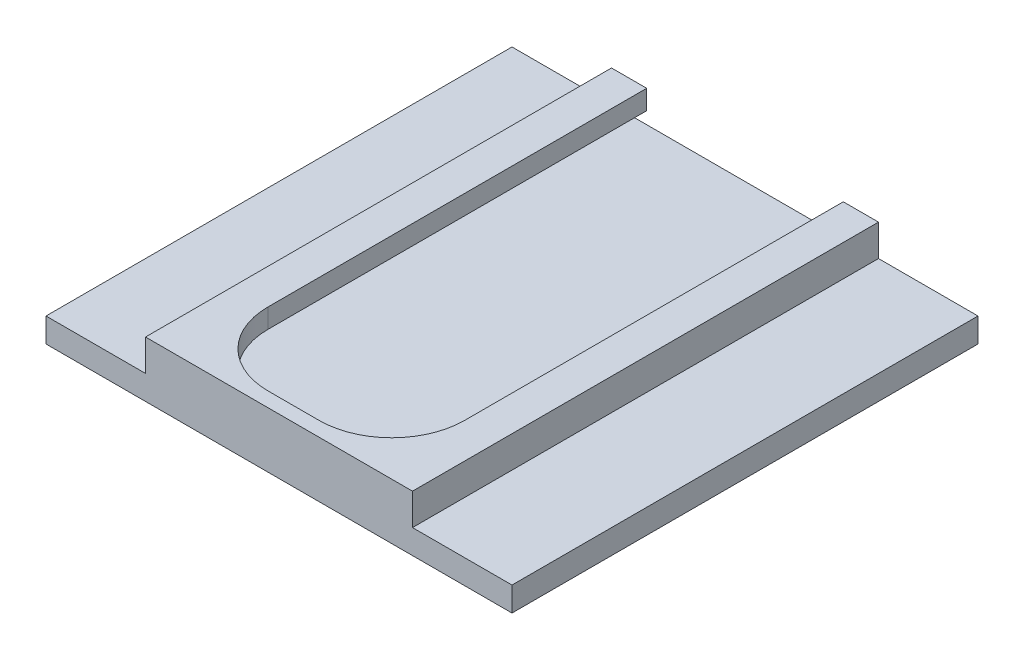
ISO-10303-21;
HEADER;
FILE_DESCRIPTION(('STEP AP214'),'2;1');
FILE_NAME('part.step','',(''),(''),'','','');
FILE_SCHEMA(('AUTOMOTIVE_DESIGN { 1 0 10303 214 1 1 1 1 }'));
ENDSEC;
DATA;
#1=APPLICATION_CONTEXT('core data for automotive mechanical design processes');
#2=APPLICATION_PROTOCOL_DEFINITION('international standard','automotive_design',2000,#1);
#3=PRODUCT_CONTEXT('',#1,'mechanical');
#4=PRODUCT('Part','Part','',(#3));
#5=PRODUCT_RELATED_PRODUCT_CATEGORY('part','',(#4));
#6=PRODUCT_DEFINITION_FORMATION('','',#4);
#7=PRODUCT_DEFINITION_CONTEXT('part definition',#1,'design');
#8=PRODUCT_DEFINITION('design','',#6,#7);
#9=PRODUCT_DEFINITION_SHAPE('','',#8);
#10=(LENGTH_UNIT() NAMED_UNIT(*) SI_UNIT(.MILLI.,.METRE.));
#11=(NAMED_UNIT(*) PLANE_ANGLE_UNIT() SI_UNIT($,.RADIAN.));
#12=(NAMED_UNIT(*) SI_UNIT($,.STERADIAN.) SOLID_ANGLE_UNIT());
#13=UNCERTAINTY_MEASURE_WITH_UNIT(LENGTH_MEASURE(1.E-05),#10,'distance_accuracy_value','');
#14=(GEOMETRIC_REPRESENTATION_CONTEXT(3) GLOBAL_UNCERTAINTY_ASSIGNED_CONTEXT((#13)) GLOBAL_UNIT_ASSIGNED_CONTEXT((#10,
#11,#12)) REPRESENTATION_CONTEXT('',''));
#15=CARTESIAN_POINT('',(0.,0.,0.));
#16=DIRECTION('',(0.,0.,1.));
#17=DIRECTION('',(1.,0.,0.));
#18=AXIS2_PLACEMENT_3D('',#15,#16,#17);
#19=CARTESIAN_POINT('',(0.,2.,0.));
#20=DIRECTION('',(0.,1.,0.));
#21=DIRECTION('',(0.,0.,1.));
#22=AXIS2_PLACEMENT_3D('',#19,#20,#21);
#23=PLANE('',#22);
#24=DIRECTION('',(0.,0.,1.));
#25=VECTOR('',#24,1.);
#26=CARTESIAN_POINT('',(-24.25,2.,-57.7371710470752));
#27=LINE('',#26,#25);
#28=CARTESIAN_POINT('',(-24.25,2.,-48.));
#29=VERTEX_POINT('',#28);
#30=CARTESIAN_POINT('',(-24.25,2.,45.));
#31=VERTEX_POINT('',#30);
#32=EDGE_CURVE('E351',#29,#31,#27,.T.);
#33=ORIENTED_EDGE('',*,*,#32,.T.);
#34=DIRECTION('',(-1.,0.,0.));
#35=VECTOR('',#34,1.);
#36=CARTESIAN_POINT('',(0.,2.,45.));
#37=LINE('',#36,#35);
#38=CARTESIAN_POINT('',(24.25,2.,45.));
#39=VERTEX_POINT('',#38);
#40=EDGE_CURVE('E482',#39,#31,#37,.T.);
#41=ORIENTED_EDGE('',*,*,#40,.F.);
#42=DIRECTION('',(0.,0.,1.));
#43=VECTOR('',#42,1.);
#44=CARTESIAN_POINT('',(24.25,2.,-57.7371710470752));
#45=LINE('',#44,#43);
#46=CARTESIAN_POINT('',(24.25,2.,-48.));
#47=VERTEX_POINT('',#46);
#48=EDGE_CURVE('E287',#47,#39,#45,.T.);
#49=ORIENTED_EDGE('',*,*,#48,.F.);
#50=DIRECTION('',(1.,0.,0.));
#51=VECTOR('',#50,1.);
#52=CARTESIAN_POINT('',(0.,2.,-48.));
#53=LINE('',#52,#51);
#54=EDGE_CURVE('E426',#29,#47,#53,.T.);
#55=ORIENTED_EDGE('',*,*,#54,.F.);
#56=EDGE_LOOP('',(#33,#41,#49,#55));
#57=FACE_BOUND('',#56,.T.);
#58=ADVANCED_FACE('F116',(#57),#23,.T.);
#59=CARTESIAN_POINT('',(-20.25,0.,-57.7371710470752));
#60=DIRECTION('',(-1.,0.,0.));
#61=DIRECTION('',(0.,-1.,0.));
#62=AXIS2_PLACEMENT_3D('',#59,#60,#61);
#63=PLANE('',#62);
#64=DIRECTION('',(0.,0.,1.));
#65=VECTOR('',#64,1.);
#66=CARTESIAN_POINT('',(-20.25,8.5,-57.7371710470752));
#67=LINE('',#66,#65);
#68=CARTESIAN_POINT('',(-20.25,8.5,-48.));
#69=VERTEX_POINT('',#68);
#70=CARTESIAN_POINT('',(-20.25,8.5,30.));
#71=VERTEX_POINT('',#70);
#72=EDGE_CURVE('E312',#69,#71,#67,.T.);
#73=ORIENTED_EDGE('',*,*,#72,.T.);
#74=DIRECTION('',(0.,-1.,0.));
#75=VECTOR('',#74,1.);
#76=CARTESIAN_POINT('',(-20.25,4.50000000000001,30.));
#77=LINE('',#76,#75);
#78=CARTESIAN_POINT('',(-20.25,4.50000000000001,30.));
#79=VERTEX_POINT('',#78);
#80=EDGE_CURVE('E457',#71,#79,#77,.T.);
#81=ORIENTED_EDGE('',*,*,#80,.T.);
#82=DIRECTION('',(0.,0.,1.));
#83=VECTOR('',#82,1.);
#84=CARTESIAN_POINT('',(-20.25,4.50000000000001,-57.7371710470752));
#85=LINE('',#84,#83);
#86=CARTESIAN_POINT('',(-20.25,4.50000000000001,-48.));
#87=VERTEX_POINT('',#86);
#88=EDGE_CURVE('E337',#87,#79,#85,.T.);
#89=ORIENTED_EDGE('',*,*,#88,.F.);
#90=DIRECTION('',(0.,-1.,0.));
#91=VECTOR('',#90,1.);
#92=CARTESIAN_POINT('',(-20.25,0.,-48.));
#93=LINE('',#92,#91);
#94=EDGE_CURVE('E333',#69,#87,#93,.T.);
#95=ORIENTED_EDGE('',*,*,#94,.F.);
#96=EDGE_LOOP('',(#73,#81,#89,#95));
#97=FACE_BOUND('',#96,.T.);
#98=ADVANCED_FACE('F560',(#97),#63,.F.);
#99=CARTESIAN_POINT('',(0.,4.50000000000001,-57.7371710470752));
#100=DIRECTION('',(0.,-1.,0.));
#101=DIRECTION('',(0.,0.,-1.));
#102=AXIS2_PLACEMENT_3D('',#99,#100,#101);
#103=PLANE('',#102);
#104=ORIENTED_EDGE('',*,*,#88,.T.);
#105=CARTESIAN_POINT('',(-5.25,4.50000000000001,30.));
#106=DIRECTION('',(0.,-1.,0.));
#107=DIRECTION('',(0.,0.,-1.));
#108=AXIS2_PLACEMENT_3D('',#105,#106,#107);
#109=CIRCLE('',#108,15.);
#110=CARTESIAN_POINT('',(-5.25,4.50000000000001,45.));
#111=VERTEX_POINT('',#110);
#112=EDGE_CURVE('E125',#79,#111,#109,.F.);
#113=ORIENTED_EDGE('',*,*,#112,.T.);
#114=DIRECTION('',(1.,0.,0.));
#115=VECTOR('',#114,1.);
#116=CARTESIAN_POINT('',(0.,4.50000000000001,45.));
#117=LINE('',#116,#115);
#118=CARTESIAN_POINT('',(-24.25,4.50000000000001,45.));
#119=VERTEX_POINT('',#118);
#120=EDGE_CURVE('E279',#119,#111,#117,.T.);
#121=ORIENTED_EDGE('',*,*,#120,.F.);
#122=DIRECTION('',(0.,0.,1.));
#123=VECTOR('',#122,1.);
#124=CARTESIAN_POINT('',(-24.25,4.50000000000001,-57.7371710470752));
#125=LINE('',#124,#123);
#126=CARTESIAN_POINT('',(-24.25,4.50000000000001,-48.));
#127=VERTEX_POINT('',#126);
#128=EDGE_CURVE('E347',#127,#119,#125,.T.);
#129=ORIENTED_EDGE('',*,*,#128,.F.);
#130=DIRECTION('',(1.,0.,0.));
#131=VECTOR('',#130,1.);
#132=CARTESIAN_POINT('',(0.,4.50000000000001,-48.));
#133=LINE('',#132,#131);
#134=EDGE_CURVE('E334',#127,#87,#133,.T.);
#135=ORIENTED_EDGE('',*,*,#134,.T.);
#136=EDGE_LOOP('',(#104,#113,#121,#129,#135));
#137=FACE_BOUND('',#136,.T.);
#138=ADVANCED_FACE('F468',(#137),#103,.T.);
#139=CARTESIAN_POINT('',(-24.25,0.,-57.7371710470752));
#140=DIRECTION('',(-1.,0.,0.));
#141=DIRECTION('',(0.,0.,1.));
#142=AXIS2_PLACEMENT_3D('',#139,#140,#141);
#143=PLANE('',#142);
#144=DIRECTION('',(0.,-1.,0.));
#145=VECTOR('',#144,1.);
#146=CARTESIAN_POINT('',(-24.25,0.,45.));
#147=LINE('',#146,#145);
#148=EDGE_CURVE('E477',#119,#31,#147,.T.);
#149=ORIENTED_EDGE('',*,*,#148,.T.);
#150=ORIENTED_EDGE('',*,*,#32,.F.);
#151=DIRECTION('',(0.,-1.,0.));
#152=VECTOR('',#151,1.);
#153=CARTESIAN_POINT('',(-24.25,0.,-48.));
#154=LINE('',#153,#152);
#155=EDGE_CURVE('E329',#127,#29,#154,.T.);
#156=ORIENTED_EDGE('',*,*,#155,.F.);
#157=ORIENTED_EDGE('',*,*,#128,.T.);
#158=EDGE_LOOP('',(#149,#150,#156,#157));
#159=FACE_BOUND('',#158,.T.);
#160=ADVANCED_FACE('F599',(#159),#143,.F.);
#161=CARTESIAN_POINT('',(20.25,0.,-57.7371710470752));
#162=DIRECTION('',(-1.,0.,0.));
#163=DIRECTION('',(0.,-1.,0.));
#164=AXIS2_PLACEMENT_3D('',#161,#162,#163);
#165=PLANE('',#164);
#166=DIRECTION('',(0.,0.,1.));
#167=VECTOR('',#166,1.);
#168=CARTESIAN_POINT('',(20.25,4.50000000000001,-57.7371710470752));
#169=LINE('',#168,#167);
#170=CARTESIAN_POINT('',(20.25,4.50000000000001,-48.));
#171=VERTEX_POINT('',#170);
#172=CARTESIAN_POINT('',(20.25,4.50000000000001,30.));
#173=VERTEX_POINT('',#172);
#174=EDGE_CURVE('E299',#171,#173,#169,.T.);
#175=ORIENTED_EDGE('',*,*,#174,.T.);
#176=DIRECTION('',(0.,-1.,0.));
#177=VECTOR('',#176,1.);
#178=CARTESIAN_POINT('',(20.25,0.,30.));
#179=LINE('',#178,#177);
#180=CARTESIAN_POINT('',(20.25,8.50000000000001,30.));
#181=VERTEX_POINT('',#180);
#182=EDGE_CURVE('E454',#173,#181,#179,.F.);
#183=ORIENTED_EDGE('',*,*,#182,.T.);
#184=DIRECTION('',(0.,0.,1.));
#185=VECTOR('',#184,1.);
#186=CARTESIAN_POINT('',(20.25,8.50000000000001,-57.7371710470752));
#187=LINE('',#186,#185);
#188=CARTESIAN_POINT('',(20.25,8.50000000000001,-48.));
#189=VERTEX_POINT('',#188);
#190=EDGE_CURVE('E308',#189,#181,#187,.T.);
#191=ORIENTED_EDGE('',*,*,#190,.F.);
#192=DIRECTION('',(0.,-1.,0.));
#193=VECTOR('',#192,1.);
#194=CARTESIAN_POINT('',(20.25,0.,-48.));
#195=LINE('',#194,#193);
#196=EDGE_CURVE('E307',#189,#171,#195,.T.);
#197=ORIENTED_EDGE('',*,*,#196,.T.);
#198=EDGE_LOOP('',(#175,#183,#191,#197));
#199=FACE_BOUND('',#198,.T.);
#200=ADVANCED_FACE('F595',(#199),#165,.T.);
#201=CARTESIAN_POINT('',(0.,4.50000000000001,-57.7371710470752));
#202=DIRECTION('',(0.,-1.,0.));
#203=DIRECTION('',(0.,0.,-1.));
#204=AXIS2_PLACEMENT_3D('',#201,#202,#203);
#205=PLANE('',#204);
#206=DIRECTION('',(0.,0.,1.));
#207=VECTOR('',#206,1.);
#208=CARTESIAN_POINT('',(24.25,4.50000000000001,-57.7371710470752));
#209=LINE('',#208,#207);
#210=CARTESIAN_POINT('',(24.25,4.50000000000001,-48.));
#211=VERTEX_POINT('',#210);
#212=CARTESIAN_POINT('',(24.25,4.50000000000001,45.));
#213=VERTEX_POINT('',#212);
#214=EDGE_CURVE('E284',#211,#213,#209,.T.);
#215=ORIENTED_EDGE('',*,*,#214,.T.);
#216=CARTESIAN_POINT('',(5.25,4.50000000000001,45.));
#217=VERTEX_POINT('',#216);
#218=EDGE_CURVE('E265',#217,#213,#117,.T.);
#219=ORIENTED_EDGE('',*,*,#218,.F.);
#220=CARTESIAN_POINT('',(5.25,4.50000000000001,30.));
#221=DIRECTION('',(0.,-1.,0.));
#222=DIRECTION('',(0.,0.,-1.));
#223=AXIS2_PLACEMENT_3D('',#220,#221,#222);
#224=CIRCLE('',#223,15.);
#225=EDGE_CURVE('E460',#217,#173,#224,.F.);
#226=ORIENTED_EDGE('',*,*,#225,.T.);
#227=ORIENTED_EDGE('',*,*,#174,.F.);
#228=DIRECTION('',(1.,0.,0.));
#229=VECTOR('',#228,1.);
#230=CARTESIAN_POINT('',(0.,4.50000000000001,-48.));
#231=LINE('',#230,#229);
#232=EDGE_CURVE('E292',#171,#211,#231,.T.);
#233=ORIENTED_EDGE('',*,*,#232,.T.);
#234=EDGE_LOOP('',(#215,#219,#226,#227,#233));
#235=FACE_BOUND('',#234,.T.);
#236=ADVANCED_FACE('F290',(#235),#205,.T.);
#237=CARTESIAN_POINT('',(24.25,0.,-57.7371710470752));
#238=DIRECTION('',(-1.,0.,0.));
#239=DIRECTION('',(0.,0.,1.));
#240=AXIS2_PLACEMENT_3D('',#237,#238,#239);
#241=PLANE('',#240);
#242=ORIENTED_EDGE('',*,*,#48,.T.);
#243=DIRECTION('',(0.,-1.,0.));
#244=VECTOR('',#243,1.);
#245=CARTESIAN_POINT('',(24.25,0.,45.));
#246=LINE('',#245,#244);
#247=EDGE_CURVE('E269',#213,#39,#246,.T.);
#248=ORIENTED_EDGE('',*,*,#247,.F.);
#249=ORIENTED_EDGE('',*,*,#214,.F.);
#250=DIRECTION('',(0.,-1.,0.));
#251=VECTOR('',#250,1.);
#252=CARTESIAN_POINT('',(24.25,0.,-48.));
#253=LINE('',#252,#251);
#254=EDGE_CURVE('E294',#211,#47,#253,.T.);
#255=ORIENTED_EDGE('',*,*,#254,.T.);
#256=EDGE_LOOP('',(#242,#248,#249,#255));
#257=FACE_BOUND('',#256,.T.);
#258=ADVANCED_FACE('F283',(#257),#241,.T.);
#259=DIRECTION('',(0.,0.,1.));
#260=VECTOR('',#259,1.);
#261=CARTESIAN_POINT('',(27.5,2.,-57.7371710470752));
#262=LINE('',#261,#260);
#263=CARTESIAN_POINT('',(27.5,2.,-48.));
#264=VERTEX_POINT('',#263);
#265=CARTESIAN_POINT('',(27.5,2.,48.));
#266=VERTEX_POINT('',#265);
#267=EDGE_CURVE('E498',#264,#266,#262,.T.);
#268=ORIENTED_EDGE('',*,*,#267,.T.);
#269=DIRECTION('',(1.,0.,0.));
#270=VECTOR('',#269,1.);
#271=CARTESIAN_POINT('',(0.,2.,48.));
#272=LINE('',#271,#270);
#273=CARTESIAN_POINT('',(48.,2.,48.));
#274=VERTEX_POINT('',#273);
#275=EDGE_CURVE('E429',#266,#274,#272,.T.);
#276=ORIENTED_EDGE('',*,*,#275,.T.);
#277=DIRECTION('',(0.,0.,1.));
#278=VECTOR('',#277,1.);
#279=CARTESIAN_POINT('',(48.,2.,0.));
#280=LINE('',#279,#278);
#281=CARTESIAN_POINT('',(48.,2.,-48.));
#282=VERTEX_POINT('',#281);
#283=EDGE_CURVE('E433',#282,#274,#280,.T.);
#284=ORIENTED_EDGE('',*,*,#283,.F.);
#285=EDGE_CURVE('E411',#264,#282,#53,.T.);
#286=ORIENTED_EDGE('',*,*,#285,.F.);
#287=EDGE_LOOP('',(#268,#276,#284,#286));
#288=FACE_BOUND('',#287,.T.);
#289=ADVANCED_FACE('F508',(#288),#23,.T.);
#290=DIRECTION('',(0.,0.,1.));
#291=VECTOR('',#290,1.);
#292=CARTESIAN_POINT('',(-27.5,2.,-57.7371710470752));
#293=LINE('',#292,#291);
#294=CARTESIAN_POINT('',(-27.5,2.,-48.));
#295=VERTEX_POINT('',#294);
#296=CARTESIAN_POINT('',(-27.5,2.,48.));
#297=VERTEX_POINT('',#296);
#298=EDGE_CURVE('E319',#295,#297,#293,.T.);
#299=ORIENTED_EDGE('',*,*,#298,.F.);
#300=CARTESIAN_POINT('',(-48.,2.,-48.));
#301=VERTEX_POINT('',#300);
#302=EDGE_CURVE('E421',#301,#295,#53,.T.);
#303=ORIENTED_EDGE('',*,*,#302,.F.);
#304=DIRECTION('',(0.,0.,1.));
#305=VECTOR('',#304,1.);
#306=CARTESIAN_POINT('',(-48.,2.,0.));
#307=LINE('',#306,#305);
#308=CARTESIAN_POINT('',(-48.,2.,48.));
#309=VERTEX_POINT('',#308);
#310=EDGE_CURVE('E425',#301,#309,#307,.T.);
#311=ORIENTED_EDGE('',*,*,#310,.T.);
#312=EDGE_CURVE('E430',#309,#297,#272,.T.);
#313=ORIENTED_EDGE('',*,*,#312,.T.);
#314=EDGE_LOOP('',(#299,#303,#311,#313));
#315=FACE_BOUND('',#314,.T.);
#316=ADVANCED_FACE('F540',(#315),#23,.T.);
#317=CARTESIAN_POINT('',(-48.,2.,0.));
#318=DIRECTION('',(1.,0.,0.));
#319=DIRECTION('',(0.,0.,-1.));
#320=AXIS2_PLACEMENT_3D('',#317,#318,#319);
#321=PLANE('',#320);
#322=DIRECTION('',(0.,-1.,0.));
#323=VECTOR('',#322,1.);
#324=CARTESIAN_POINT('',(-48.,2.,-48.));
#325=LINE('',#324,#323);
#326=CARTESIAN_POINT('',(-48.,-3.,-48.));
#327=VERTEX_POINT('',#326);
#328=EDGE_CURVE('E446',#301,#327,#325,.T.);
#329=ORIENTED_EDGE('',*,*,#328,.T.);
#330=DIRECTION('',(0.,0.,1.));
#331=VECTOR('',#330,1.);
#332=CARTESIAN_POINT('',(-48.,-3.,0.));
#333=LINE('',#332,#331);
#334=CARTESIAN_POINT('',(-48.,-3.,48.));
#335=VERTEX_POINT('',#334);
#336=EDGE_CURVE('E366',#327,#335,#333,.T.);
#337=ORIENTED_EDGE('',*,*,#336,.T.);
#338=DIRECTION('',(0.,-1.,0.));
#339=VECTOR('',#338,1.);
#340=CARTESIAN_POINT('',(-48.,2.,48.));
#341=LINE('',#340,#339);
#342=EDGE_CURVE('E443',#309,#335,#341,.T.);
#343=ORIENTED_EDGE('',*,*,#342,.F.);
#344=ORIENTED_EDGE('',*,*,#310,.F.);
#345=EDGE_LOOP('',(#329,#337,#343,#344));
#346=FACE_BOUND('',#345,.T.);
#347=ADVANCED_FACE('F537',(#346),#321,.F.);
#348=CARTESIAN_POINT('',(0.,2.,48.));
#349=DIRECTION('',(0.,0.,-1.));
#350=DIRECTION('',(-1.,0.,0.));
#351=AXIS2_PLACEMENT_3D('',#348,#349,#350);
#352=PLANE('',#351);
#353=DIRECTION('',(0.,1.,0.));
#354=VECTOR('',#353,1.);
#355=CARTESIAN_POINT('',(27.5,0.,48.));
#356=LINE('',#355,#354);
#357=CARTESIAN_POINT('',(27.5,8.50000000000001,48.));
#358=VERTEX_POINT('',#357);
#359=EDGE_CURVE('E486',#266,#358,#356,.T.);
#360=ORIENTED_EDGE('',*,*,#359,.T.);
#361=DIRECTION('',(1.,0.,0.));
#362=VECTOR('',#361,1.);
#363=CARTESIAN_POINT('',(0.,8.50000000000001,48.));
#364=LINE('',#363,#362);
#365=CARTESIAN_POINT('',(-27.5,8.5,48.));
#366=VERTEX_POINT('',#365);
#367=EDGE_CURVE('E320',#366,#358,#364,.T.);
#368=ORIENTED_EDGE('',*,*,#367,.F.);
#369=DIRECTION('',(0.,1.,0.));
#370=VECTOR('',#369,1.);
#371=CARTESIAN_POINT('',(-27.5,0.,48.));
#372=LINE('',#371,#370);
#373=EDGE_CURVE('E314',#297,#366,#372,.T.);
#374=ORIENTED_EDGE('',*,*,#373,.F.);
#375=ORIENTED_EDGE('',*,*,#312,.F.);
#376=ORIENTED_EDGE('',*,*,#342,.T.);
#377=DIRECTION('',(1.,0.,0.));
#378=VECTOR('',#377,1.);
#379=CARTESIAN_POINT('',(0.,-3.,48.));
#380=LINE('',#379,#378);
#381=CARTESIAN_POINT('',(48.,-3.,48.));
#382=VERTEX_POINT('',#381);
#383=EDGE_CURVE('E371',#335,#382,#380,.T.);
#384=ORIENTED_EDGE('',*,*,#383,.T.);
#385=DIRECTION('',(0.,-1.,0.));
#386=VECTOR('',#385,1.);
#387=CARTESIAN_POINT('',(48.,2.,48.));
#388=LINE('',#387,#386);
#389=EDGE_CURVE('E440',#274,#382,#388,.T.);
#390=ORIENTED_EDGE('',*,*,#389,.F.);
#391=ORIENTED_EDGE('',*,*,#275,.F.);
#392=EDGE_LOOP('',(#360,#368,#374,#375,#376,#384,#390,#391));
#393=FACE_BOUND('',#392,.T.);
#394=ADVANCED_FACE('F514',(#393),#352,.F.);
#395=CARTESIAN_POINT('',(48.,2.,0.));
#396=DIRECTION('',(1.,0.,0.));
#397=DIRECTION('',(0.,0.,-1.));
#398=AXIS2_PLACEMENT_3D('',#395,#396,#397);
#399=PLANE('',#398);
#400=ORIENTED_EDGE('',*,*,#389,.T.);
#401=DIRECTION('',(0.,0.,1.));
#402=VECTOR('',#401,1.);
#403=CARTESIAN_POINT('',(48.,-3.,0.));
#404=LINE('',#403,#402);
#405=CARTESIAN_POINT('',(48.,-3.,-48.));
#406=VERTEX_POINT('',#405);
#407=EDGE_CURVE('E375',#406,#382,#404,.T.);
#408=ORIENTED_EDGE('',*,*,#407,.F.);
#409=DIRECTION('',(0.,-1.,0.));
#410=VECTOR('',#409,1.);
#411=CARTESIAN_POINT('',(48.,2.,-48.));
#412=LINE('',#411,#410);
#413=EDGE_CURVE('E437',#282,#406,#412,.T.);
#414=ORIENTED_EDGE('',*,*,#413,.F.);
#415=ORIENTED_EDGE('',*,*,#283,.T.);
#416=EDGE_LOOP('',(#400,#408,#414,#415));
#417=FACE_BOUND('',#416,.T.);
#418=ADVANCED_FACE('F526',(#417),#399,.T.);
#419=CARTESIAN_POINT('',(0.,2.,-48.));
#420=DIRECTION('',(0.,0.,-1.));
#421=DIRECTION('',(-1.,0.,0.));
#422=AXIS2_PLACEMENT_3D('',#419,#420,#421);
#423=PLANE('',#422);
#424=ORIENTED_EDGE('',*,*,#413,.T.);
#425=DIRECTION('',(1.,0.,0.));
#426=VECTOR('',#425,1.);
#427=CARTESIAN_POINT('',(0.,-3.,-48.));
#428=LINE('',#427,#426);
#429=EDGE_CURVE('E362',#327,#406,#428,.T.);
#430=ORIENTED_EDGE('',*,*,#429,.F.);
#431=ORIENTED_EDGE('',*,*,#328,.F.);
#432=ORIENTED_EDGE('',*,*,#302,.T.);
#433=DIRECTION('',(0.,1.,0.));
#434=VECTOR('',#433,1.);
#435=CARTESIAN_POINT('',(-27.5,0.,-48.));
#436=LINE('',#435,#434);
#437=CARTESIAN_POINT('',(-27.5,8.5,-48.));
#438=VERTEX_POINT('',#437);
#439=EDGE_CURVE('E324',#295,#438,#436,.T.);
#440=ORIENTED_EDGE('',*,*,#439,.T.);
#441=DIRECTION('',(1.,0.,0.));
#442=VECTOR('',#441,1.);
#443=CARTESIAN_POINT('',(0.,8.50000000000001,-48.));
#444=LINE('',#443,#442);
#445=EDGE_CURVE('E323',#438,#69,#444,.T.);
#446=ORIENTED_EDGE('',*,*,#445,.T.);
#447=ORIENTED_EDGE('',*,*,#94,.T.);
#448=ORIENTED_EDGE('',*,*,#134,.F.);
#449=ORIENTED_EDGE('',*,*,#155,.T.);
#450=ORIENTED_EDGE('',*,*,#54,.T.);
#451=ORIENTED_EDGE('',*,*,#254,.F.);
#452=ORIENTED_EDGE('',*,*,#232,.F.);
#453=ORIENTED_EDGE('',*,*,#196,.F.);
#454=DIRECTION('',(1.,0.,0.));
#455=VECTOR('',#454,1.);
#456=CARTESIAN_POINT('',(0.,8.50000000000001,-48.));
#457=LINE('',#456,#455);
#458=CARTESIAN_POINT('',(27.5,8.50000000000001,-48.));
#459=VERTEX_POINT('',#458);
#460=EDGE_CURVE('E485',#189,#459,#457,.T.);
#461=ORIENTED_EDGE('',*,*,#460,.T.);
#462=DIRECTION('',(0.,1.,0.));
#463=VECTOR('',#462,1.);
#464=CARTESIAN_POINT('',(27.5,0.,-48.));
#465=LINE('',#464,#463);
#466=EDGE_CURVE('E495',#264,#459,#465,.T.);
#467=ORIENTED_EDGE('',*,*,#466,.F.);
#468=ORIENTED_EDGE('',*,*,#285,.T.);
#469=EDGE_LOOP('',(#424,#430,#431,#432,#440,#446,#447,#448,#449,#450,#451,#452,#453,#461,#467,#468));
#470=FACE_BOUND('',#469,.T.);
#471=ADVANCED_FACE('F522',(#470),#423,.T.);
#472=CARTESIAN_POINT('',(0.,-3.,-45.));
#473=DIRECTION('',(0.,0.,1.));
#474=DIRECTION('',(1.,0.,0.));
#475=AXIS2_PLACEMENT_3D('',#472,#473,#474);
#476=PLANE('',#475);
#477=DIRECTION('',(1.,0.,0.));
#478=VECTOR('',#477,1.);
#479=CARTESIAN_POINT('',(0.,0.,-45.));
#480=LINE('',#479,#478);
#481=CARTESIAN_POINT('',(-45.,0.,-45.));
#482=VERTEX_POINT('',#481);
#483=CARTESIAN_POINT('',(45.,0.,-45.));
#484=VERTEX_POINT('',#483);
#485=EDGE_CURVE('E328',#482,#484,#480,.T.);
#486=ORIENTED_EDGE('',*,*,#485,.F.);
#487=DIRECTION('',(0.,1.,0.));
#488=VECTOR('',#487,1.);
#489=CARTESIAN_POINT('',(-45.,-3.,-45.));
#490=LINE('',#489,#488);
#491=CARTESIAN_POINT('',(-45.,-3.,-45.));
#492=VERTEX_POINT('',#491);
#493=EDGE_CURVE('E408',#492,#482,#490,.T.);
#494=ORIENTED_EDGE('',*,*,#493,.F.);
#495=DIRECTION('',(1.,0.,0.));
#496=VECTOR('',#495,1.);
#497=CARTESIAN_POINT('',(0.,-3.,-45.));
#498=LINE('',#497,#496);
#499=CARTESIAN_POINT('',(45.,-3.,-45.));
#500=VERTEX_POINT('',#499);
#501=EDGE_CURVE('E379',#492,#500,#498,.T.);
#502=ORIENTED_EDGE('',*,*,#501,.T.);
#503=DIRECTION('',(0.,1.,0.));
#504=VECTOR('',#503,1.);
#505=CARTESIAN_POINT('',(45.,-3.,-45.));
#506=LINE('',#505,#504);
#507=EDGE_CURVE('E394',#500,#484,#506,.T.);
#508=ORIENTED_EDGE('',*,*,#507,.T.);
#509=EDGE_LOOP('',(#486,#494,#502,#508));
#510=FACE_BOUND('',#509,.T.);
#511=ADVANCED_FACE('F573',(#510),#476,.T.);
#512=CARTESIAN_POINT('',(-45.,-3.,0.));
#513=DIRECTION('',(-1.,0.,0.));
#514=DIRECTION('',(0.,0.,1.));
#515=AXIS2_PLACEMENT_3D('',#512,#513,#514);
#516=PLANE('',#515);
#517=DIRECTION('',(0.,0.,1.));
#518=VECTOR('',#517,1.);
#519=CARTESIAN_POINT('',(-45.,0.,0.));
#520=LINE('',#519,#518);
#521=CARTESIAN_POINT('',(-45.,0.,45.));
#522=VERTEX_POINT('',#521);
#523=EDGE_CURVE('E367',#482,#522,#520,.T.);
#524=ORIENTED_EDGE('',*,*,#523,.T.);
#525=DIRECTION('',(0.,1.,0.));
#526=VECTOR('',#525,1.);
#527=CARTESIAN_POINT('',(-45.,-3.,45.));
#528=LINE('',#527,#526);
#529=CARTESIAN_POINT('',(-45.,-3.,45.));
#530=VERTEX_POINT('',#529);
#531=EDGE_CURVE('E412',#530,#522,#528,.T.);
#532=ORIENTED_EDGE('',*,*,#531,.F.);
#533=DIRECTION('',(0.,0.,1.));
#534=VECTOR('',#533,1.);
#535=CARTESIAN_POINT('',(-45.,-3.,0.));
#536=LINE('',#535,#534);
#537=EDGE_CURVE('E390',#492,#530,#536,.T.);
#538=ORIENTED_EDGE('',*,*,#537,.F.);
#539=ORIENTED_EDGE('',*,*,#493,.T.);
#540=EDGE_LOOP('',(#524,#532,#538,#539));
#541=FACE_BOUND('',#540,.T.);
#542=ADVANCED_FACE('F579',(#541),#516,.F.);
#543=CARTESIAN_POINT('',(0.,-3.,45.));
#544=DIRECTION('',(0.,0.,1.));
#545=DIRECTION('',(1.,0.,0.));
#546=AXIS2_PLACEMENT_3D('',#543,#544,#545);
#547=PLANE('',#546);
#548=DIRECTION('',(1.,0.,0.));
#549=VECTOR('',#548,1.);
#550=CARTESIAN_POINT('',(0.,0.,45.));
#551=LINE('',#550,#549);
#552=CARTESIAN_POINT('',(45.,0.,45.));
#553=VERTEX_POINT('',#552);
#554=EDGE_CURVE('E402',#522,#553,#551,.T.);
#555=ORIENTED_EDGE('',*,*,#554,.T.);
#556=DIRECTION('',(0.,1.,0.));
#557=VECTOR('',#556,1.);
#558=CARTESIAN_POINT('',(45.,-3.,45.));
#559=LINE('',#558,#557);
#560=CARTESIAN_POINT('',(45.,-3.,45.));
#561=VERTEX_POINT('',#560);
#562=EDGE_CURVE('E415',#561,#553,#559,.T.);
#563=ORIENTED_EDGE('',*,*,#562,.F.);
#564=DIRECTION('',(1.,0.,0.));
#565=VECTOR('',#564,1.);
#566=CARTESIAN_POINT('',(0.,-3.,45.));
#567=LINE('',#566,#565);
#568=EDGE_CURVE('E387',#530,#561,#567,.T.);
#569=ORIENTED_EDGE('',*,*,#568,.F.);
#570=ORIENTED_EDGE('',*,*,#531,.T.);
#571=EDGE_LOOP('',(#555,#563,#569,#570));
#572=FACE_BOUND('',#571,.T.);
#573=ADVANCED_FACE('F620',(#572),#547,.F.);
#574=CARTESIAN_POINT('',(45.,-3.,0.));
#575=DIRECTION('',(-1.,0.,0.));
#576=DIRECTION('',(0.,0.,1.));
#577=AXIS2_PLACEMENT_3D('',#574,#575,#576);
#578=PLANE('',#577);
#579=DIRECTION('',(0.,0.,1.));
#580=VECTOR('',#579,1.);
#581=CARTESIAN_POINT('',(45.,0.,0.));
#582=LINE('',#581,#580);
#583=EDGE_CURVE('E398',#484,#553,#582,.T.);
#584=ORIENTED_EDGE('',*,*,#583,.F.);
#585=ORIENTED_EDGE('',*,*,#507,.F.);
#586=DIRECTION('',(0.,0.,1.));
#587=VECTOR('',#586,1.);
#588=CARTESIAN_POINT('',(45.,-3.,0.));
#589=LINE('',#588,#587);
#590=EDGE_CURVE('E383',#500,#561,#589,.T.);
#591=ORIENTED_EDGE('',*,*,#590,.T.);
#592=ORIENTED_EDGE('',*,*,#562,.T.);
#593=EDGE_LOOP('',(#584,#585,#591,#592));
#594=FACE_BOUND('',#593,.T.);
#595=ADVANCED_FACE('F617',(#594),#578,.T.);
#596=CARTESIAN_POINT('',(0.,-3.,0.));
#597=DIRECTION('',(0.,1.,0.));
#598=DIRECTION('',(0.,0.,1.));
#599=AXIS2_PLACEMENT_3D('',#596,#597,#598);
#600=PLANE('',#599);
#601=ORIENTED_EDGE('',*,*,#429,.T.);
#602=ORIENTED_EDGE('',*,*,#407,.T.);
#603=ORIENTED_EDGE('',*,*,#383,.F.);
#604=ORIENTED_EDGE('',*,*,#336,.F.);
#605=EDGE_LOOP('',(#601,#602,#603,#604));
#606=FACE_BOUND('',#605,.T.);
#607=ORIENTED_EDGE('',*,*,#501,.F.);
#608=ORIENTED_EDGE('',*,*,#537,.T.);
#609=ORIENTED_EDGE('',*,*,#568,.T.);
#610=ORIENTED_EDGE('',*,*,#590,.F.);
#611=EDGE_LOOP('',(#607,#608,#609,#610));
#612=FACE_BOUND('',#611,.T.);
#613=ADVANCED_FACE('F530',(#606,#612),#600,.F.);
#614=CARTESIAN_POINT('',(0.,0.,0.));
#615=DIRECTION('',(0.,1.,0.));
#616=DIRECTION('',(0.,0.,1.));
#617=AXIS2_PLACEMENT_3D('',#614,#615,#616);
#618=PLANE('',#617);
#619=ORIENTED_EDGE('',*,*,#523,.F.);
#620=ORIENTED_EDGE('',*,*,#485,.T.);
#621=ORIENTED_EDGE('',*,*,#583,.T.);
#622=ORIENTED_EDGE('',*,*,#554,.F.);
#623=EDGE_LOOP('',(#619,#620,#621,#622));
#624=FACE_BOUND('',#623,.T.);
#625=ADVANCED_FACE('F616',(#624),#618,.F.);
#626=CARTESIAN_POINT('',(-27.5,0.,-57.7371710470752));
#627=DIRECTION('',(1.,0.,0.));
#628=DIRECTION('',(0.,0.,-1.));
#629=AXIS2_PLACEMENT_3D('',#626,#627,#628);
#630=PLANE('',#629);
#631=ORIENTED_EDGE('',*,*,#439,.F.);
#632=ORIENTED_EDGE('',*,*,#298,.T.);
#633=ORIENTED_EDGE('',*,*,#373,.T.);
#634=DIRECTION('',(0.,0.,1.));
#635=VECTOR('',#634,1.);
#636=CARTESIAN_POINT('',(-27.5,8.5,-57.7371710470752));
#637=LINE('',#636,#635);
#638=EDGE_CURVE('E318',#438,#366,#637,.T.);
#639=ORIENTED_EDGE('',*,*,#638,.F.);
#640=EDGE_LOOP('',(#631,#632,#633,#639));
#641=FACE_BOUND('',#640,.T.);
#642=ADVANCED_FACE('F543',(#641),#630,.F.);
#643=CARTESIAN_POINT('',(0.,8.50000000000001,-57.7371710470752));
#644=DIRECTION('',(0.,-1.,0.));
#645=DIRECTION('',(1.,0.,0.));
#646=AXIS2_PLACEMENT_3D('',#643,#644,#645);
#647=PLANE('',#646);
#648=ORIENTED_EDGE('',*,*,#445,.F.);
#649=ORIENTED_EDGE('',*,*,#638,.T.);
#650=ORIENTED_EDGE('',*,*,#367,.T.);
#651=DIRECTION('',(0.,0.,1.));
#652=VECTOR('',#651,1.);
#653=CARTESIAN_POINT('',(27.5,8.50000000000001,-57.7371710470752));
#654=LINE('',#653,#652);
#655=EDGE_CURVE('E313',#459,#358,#654,.T.);
#656=ORIENTED_EDGE('',*,*,#655,.F.);
#657=ORIENTED_EDGE('',*,*,#460,.F.);
#658=ORIENTED_EDGE('',*,*,#190,.T.);
#659=CARTESIAN_POINT('',(5.24999999999999,8.50000000000001,30.));
#660=DIRECTION('',(0.,-1.,0.));
#661=DIRECTION('',(1.,0.,0.));
#662=AXIS2_PLACEMENT_3D('',#659,#660,#661);
#663=CIRCLE('',#662,15.);
#664=CARTESIAN_POINT('',(5.24999999999999,8.50000000000001,45.));
#665=VERTEX_POINT('',#664);
#666=EDGE_CURVE('E463',#181,#665,#663,.T.);
#667=ORIENTED_EDGE('',*,*,#666,.T.);
#668=DIRECTION('',(1.,0.,0.));
#669=VECTOR('',#668,1.);
#670=CARTESIAN_POINT('',(0.,8.50000000000001,45.));
#671=LINE('',#670,#669);
#672=CARTESIAN_POINT('',(-5.24999999999999,8.5,45.));
#673=VERTEX_POINT('',#672);
#674=EDGE_CURVE('E277',#673,#665,#671,.T.);
#675=ORIENTED_EDGE('',*,*,#674,.F.);
#676=CARTESIAN_POINT('',(-5.24999999999999,8.5,30.));
#677=DIRECTION('',(0.,-1.,0.));
#678=DIRECTION('',(1.,0.,0.));
#679=AXIS2_PLACEMENT_3D('',#676,#677,#678);
#680=CIRCLE('',#679,15.);
#681=EDGE_CURVE('E12',#673,#71,#680,.T.);
#682=ORIENTED_EDGE('',*,*,#681,.T.);
#683=ORIENTED_EDGE('',*,*,#72,.F.);
#684=EDGE_LOOP('',(#648,#649,#650,#656,#657,#658,#667,#675,#682,#683));
#685=FACE_BOUND('',#684,.T.);
#686=ADVANCED_FACE('F472',(#685),#647,.F.);
#687=CARTESIAN_POINT('',(27.5,0.,-57.7371710470752));
#688=DIRECTION('',(1.,0.,0.));
#689=DIRECTION('',(0.,0.,-1.));
#690=AXIS2_PLACEMENT_3D('',#687,#688,#689);
#691=PLANE('',#690);
#692=ORIENTED_EDGE('',*,*,#267,.F.);
#693=ORIENTED_EDGE('',*,*,#466,.T.);
#694=ORIENTED_EDGE('',*,*,#655,.T.);
#695=ORIENTED_EDGE('',*,*,#359,.F.);
#696=EDGE_LOOP('',(#692,#693,#694,#695));
#697=FACE_BOUND('',#696,.T.);
#698=ADVANCED_FACE('F546',(#697),#691,.T.);
#699=CARTESIAN_POINT('',(0.,0.,45.));
#700=DIRECTION('',(0.,0.,1.));
#701=DIRECTION('',(1.,0.,0.));
#702=AXIS2_PLACEMENT_3D('',#699,#700,#701);
#703=PLANE('',#702);
#704=ORIENTED_EDGE('',*,*,#674,.T.);
#705=DIRECTION('',(0.,-1.,0.));
#706=VECTOR('',#705,1.);
#707=CARTESIAN_POINT('',(5.25,0.,45.));
#708=LINE('',#707,#706);
#709=EDGE_CURVE('E272',#665,#217,#708,.T.);
#710=ORIENTED_EDGE('',*,*,#709,.T.);
#711=ORIENTED_EDGE('',*,*,#218,.T.);
#712=ORIENTED_EDGE('',*,*,#247,.T.);
#713=ORIENTED_EDGE('',*,*,#40,.T.);
#714=ORIENTED_EDGE('',*,*,#148,.F.);
#715=ORIENTED_EDGE('',*,*,#120,.T.);
#716=DIRECTION('',(0.,-1.,0.));
#717=VECTOR('',#716,1.);
#718=CARTESIAN_POINT('',(-5.24999999999999,8.49999999999999,45.));
#719=LINE('',#718,#717);
#720=EDGE_CURVE('E449',#111,#673,#719,.F.);
#721=ORIENTED_EDGE('',*,*,#720,.T.);
#722=EDGE_LOOP('',(#704,#710,#711,#712,#713,#714,#715,#721));
#723=FACE_BOUND('',#722,.T.);
#724=ADVANCED_FACE('F268',(#723),#703,.F.);
#725=CARTESIAN_POINT('',(5.25,0.,30.));
#726=DIRECTION('',(0.,-1.,0.));
#727=DIRECTION('',(1.,0.,0.));
#728=AXIS2_PLACEMENT_3D('',#725,#726,#727);
#729=CYLINDRICAL_SURFACE('',#728,15.);
#730=ORIENTED_EDGE('',*,*,#666,.F.);
#731=ORIENTED_EDGE('',*,*,#182,.F.);
#732=ORIENTED_EDGE('',*,*,#225,.F.);
#733=ORIENTED_EDGE('',*,*,#709,.F.);
#734=EDGE_LOOP('',(#730,#731,#732,#733));
#735=FACE_BOUND('',#734,.T.);
#736=ADVANCED_FACE('F554',(#735),#729,.F.);
#737=CARTESIAN_POINT('',(-5.25,0.,30.));
#738=DIRECTION('',(0.,1.,0.));
#739=DIRECTION('',(-1.,0.,0.));
#740=AXIS2_PLACEMENT_3D('',#737,#738,#739);
#741=CYLINDRICAL_SURFACE('',#740,15.);
#742=ORIENTED_EDGE('',*,*,#681,.F.);
#743=ORIENTED_EDGE('',*,*,#720,.F.);
#744=ORIENTED_EDGE('',*,*,#112,.F.);
#745=ORIENTED_EDGE('',*,*,#80,.F.);
#746=EDGE_LOOP('',(#742,#743,#744,#745));
#747=FACE_BOUND('',#746,.T.);
#748=ADVANCED_FACE('F118',(#747),#741,.F.);
#749=CLOSED_SHELL('',(#58,#98,#138,#160,#200,#236,#258,#289,#316,#347,#394,#418,#471,#511,#542,
#573,#595,#613,#625,#642,#686,#698,#724,#736,#748));
#750=MANIFOLD_SOLID_BREP('B2',#749);
#751=ADVANCED_BREP_SHAPE_REPRESENTATION('',(#18,#750),#14);
#752=SHAPE_DEFINITION_REPRESENTATION(#9,#751);
ENDSEC;
END-ISO-10303-21;
